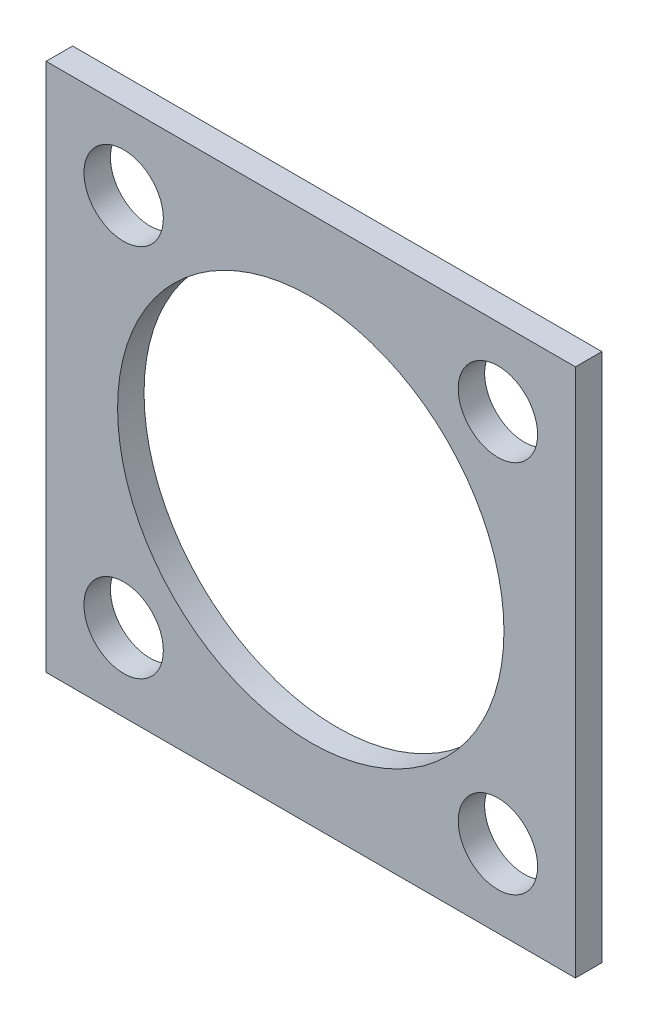
ISO-10303-21;
HEADER;
FILE_DESCRIPTION(('STEP AP214'),'2;1');
FILE_NAME('part.step','',(''),(''),'','','');
FILE_SCHEMA(('AUTOMOTIVE_DESIGN { 1 0 10303 214 1 1 1 1 }'));
ENDSEC;
DATA;
#1=APPLICATION_CONTEXT('core data for automotive mechanical design processes');
#2=APPLICATION_PROTOCOL_DEFINITION('international standard','automotive_design',2000,#1);
#3=PRODUCT_CONTEXT('',#1,'mechanical');
#4=PRODUCT('Part','Part','',(#3));
#5=PRODUCT_RELATED_PRODUCT_CATEGORY('part','',(#4));
#6=PRODUCT_DEFINITION_FORMATION('','',#4);
#7=PRODUCT_DEFINITION_CONTEXT('part definition',#1,'design');
#8=PRODUCT_DEFINITION('design','',#6,#7);
#9=PRODUCT_DEFINITION_SHAPE('','',#8);
#10=(LENGTH_UNIT() NAMED_UNIT(*) SI_UNIT(.MILLI.,.METRE.));
#11=(NAMED_UNIT(*) PLANE_ANGLE_UNIT() SI_UNIT($,.RADIAN.));
#12=(NAMED_UNIT(*) SI_UNIT($,.STERADIAN.) SOLID_ANGLE_UNIT());
#13=UNCERTAINTY_MEASURE_WITH_UNIT(LENGTH_MEASURE(1.E-05),#10,'distance_accuracy_value','');
#14=(GEOMETRIC_REPRESENTATION_CONTEXT(3) GLOBAL_UNCERTAINTY_ASSIGNED_CONTEXT((#13)) GLOBAL_UNIT_ASSIGNED_CONTEXT((#10,
#11,#12)) REPRESENTATION_CONTEXT('',''));
#15=CARTESIAN_POINT('',(0.,0.,0.));
#16=DIRECTION('',(0.,0.,1.));
#17=DIRECTION('',(1.,0.,0.));
#18=AXIS2_PLACEMENT_3D('',#15,#16,#17);
#19=CARTESIAN_POINT('',(0.,0.,1.));
#20=DIRECTION('',(0.,0.,1.));
#21=DIRECTION('',(1.,0.,0.));
#22=AXIS2_PLACEMENT_3D('',#19,#20,#21);
#23=PLANE('',#22);
#24=CARTESIAN_POINT('',(-7.07106781186547,-7.07106781186548,1.));
#25=DIRECTION('',(0.,0.,1.));
#26=DIRECTION('',(1.,0.,0.));
#27=AXIS2_PLACEMENT_3D('',#24,#25,#26);
#28=CIRCLE('',#27,1.5);
#29=CARTESIAN_POINT('',(-5.57106781186547,-7.07106781186548,1.));
#30=VERTEX_POINT('',#29);
#31=EDGE_CURVE('E134',#30,#30,#28,.T.);
#32=ORIENTED_EDGE('',*,*,#31,.F.);
#33=EDGE_LOOP('',(#32));
#34=FACE_BOUND('',#33,.T.);
#35=CARTESIAN_POINT('',(7.07106781186547,-7.07106781186547,1.));
#36=DIRECTION('',(0.,0.,1.));
#37=DIRECTION('',(1.,0.,0.));
#38=AXIS2_PLACEMENT_3D('',#35,#36,#37);
#39=CIRCLE('',#38,1.5);
#40=CARTESIAN_POINT('',(8.57106781186548,-7.07106781186547,1.));
#41=VERTEX_POINT('',#40);
#42=EDGE_CURVE('E140',#41,#41,#39,.T.);
#43=ORIENTED_EDGE('',*,*,#42,.F.);
#44=EDGE_LOOP('',(#43));
#45=FACE_BOUND('',#44,.T.);
#46=CARTESIAN_POINT('',(7.07106781186547,7.07106781186547,1.));
#47=DIRECTION('',(0.,0.,1.));
#48=DIRECTION('',(1.,0.,0.));
#49=AXIS2_PLACEMENT_3D('',#46,#47,#48);
#50=CIRCLE('',#49,1.5);
#51=CARTESIAN_POINT('',(8.57106781186548,7.07106781186547,1.));
#52=VERTEX_POINT('',#51);
#53=EDGE_CURVE('E146',#52,#52,#50,.T.);
#54=ORIENTED_EDGE('',*,*,#53,.F.);
#55=EDGE_LOOP('',(#54));
#56=FACE_BOUND('',#55,.T.);
#57=CARTESIAN_POINT('',(-7.07106781186547,7.07106781186547,1.));
#58=DIRECTION('',(0.,0.,1.));
#59=DIRECTION('',(1.,0.,0.));
#60=AXIS2_PLACEMENT_3D('',#57,#58,#59);
#61=CIRCLE('',#60,1.5);
#62=CARTESIAN_POINT('',(-5.57106781186547,7.07106781186547,1.));
#63=VERTEX_POINT('',#62);
#64=EDGE_CURVE('E128',#63,#63,#61,.T.);
#65=ORIENTED_EDGE('',*,*,#64,.F.);
#66=EDGE_LOOP('',(#65));
#67=FACE_BOUND('',#66,.T.);
#68=DIRECTION('',(0.,-1.,0.));
#69=VECTOR('',#68,1.);
#70=CARTESIAN_POINT('',(-10.,-10.,1.));
#71=LINE('',#70,#69);
#72=CARTESIAN_POINT('',(-10.,10.,1.));
#73=VERTEX_POINT('',#72);
#74=CARTESIAN_POINT('',(-10.,-10.,1.));
#75=VERTEX_POINT('',#74);
#76=EDGE_CURVE('E95',#73,#75,#71,.T.);
#77=ORIENTED_EDGE('',*,*,#76,.T.);
#78=DIRECTION('',(1.,0.,0.));
#79=VECTOR('',#78,1.);
#80=CARTESIAN_POINT('',(10.,-10.,1.));
#81=LINE('',#80,#79);
#82=CARTESIAN_POINT('',(10.,-10.,1.));
#83=VERTEX_POINT('',#82);
#84=EDGE_CURVE('E90',#75,#83,#81,.T.);
#85=ORIENTED_EDGE('',*,*,#84,.T.);
#86=DIRECTION('',(0.,1.,0.));
#87=VECTOR('',#86,1.);
#88=CARTESIAN_POINT('',(10.,-10.,1.));
#89=LINE('',#88,#87);
#90=CARTESIAN_POINT('',(10.,10.,1.));
#91=VERTEX_POINT('',#90);
#92=EDGE_CURVE('E93',#83,#91,#89,.T.);
#93=ORIENTED_EDGE('',*,*,#92,.T.);
#94=DIRECTION('',(-1.,0.,0.));
#95=VECTOR('',#94,1.);
#96=CARTESIAN_POINT('',(10.,10.,1.));
#97=LINE('',#96,#95);
#98=EDGE_CURVE('E60',#91,#73,#97,.T.);
#99=ORIENTED_EDGE('',*,*,#98,.T.);
#100=EDGE_LOOP('',(#77,#85,#93,#99));
#101=FACE_BOUND('',#100,.T.);
#102=CARTESIAN_POINT('',(0.,0.,1.));
#103=DIRECTION('',(0.,0.,1.));
#104=DIRECTION('',(1.,0.,0.));
#105=AXIS2_PLACEMENT_3D('',#102,#103,#104);
#106=CIRCLE('',#105,7.3);
#107=CARTESIAN_POINT('',(7.3,0.,1.));
#108=VERTEX_POINT('',#107);
#109=EDGE_CURVE('E110',#108,#108,#106,.T.);
#110=ORIENTED_EDGE('',*,*,#109,.F.);
#111=EDGE_LOOP('',(#110));
#112=FACE_BOUND('',#111,.T.);
#113=ADVANCED_FACE('F43',(#34,#45,#56,#67,#101,#112),#23,.T.);
#114=CARTESIAN_POINT('',(0.,0.,0.));
#115=DIRECTION('',(0.,0.,1.));
#116=DIRECTION('',(1.,0.,0.));
#117=AXIS2_PLACEMENT_3D('',#114,#115,#116);
#118=PLANE('',#117);
#119=CARTESIAN_POINT('',(-7.07106781186547,-7.07106781186548,0.));
#120=DIRECTION('',(0.,0.,1.));
#121=DIRECTION('',(1.,0.,0.));
#122=AXIS2_PLACEMENT_3D('',#119,#120,#121);
#123=CIRCLE('',#122,1.5);
#124=CARTESIAN_POINT('',(-5.57106781186547,-7.07106781186548,0.));
#125=VERTEX_POINT('',#124);
#126=EDGE_CURVE('E137',#125,#125,#123,.T.);
#127=ORIENTED_EDGE('',*,*,#126,.T.);
#128=EDGE_LOOP('',(#127));
#129=FACE_BOUND('',#128,.T.);
#130=CARTESIAN_POINT('',(7.07106781186547,-7.07106781186547,0.));
#131=DIRECTION('',(0.,0.,1.));
#132=DIRECTION('',(1.,0.,0.));
#133=AXIS2_PLACEMENT_3D('',#130,#131,#132);
#134=CIRCLE('',#133,1.5);
#135=CARTESIAN_POINT('',(8.57106781186548,-7.07106781186547,0.));
#136=VERTEX_POINT('',#135);
#137=EDGE_CURVE('E143',#136,#136,#134,.T.);
#138=ORIENTED_EDGE('',*,*,#137,.T.);
#139=EDGE_LOOP('',(#138));
#140=FACE_BOUND('',#139,.T.);
#141=CARTESIAN_POINT('',(7.07106781186547,7.07106781186547,0.));
#142=DIRECTION('',(0.,0.,1.));
#143=DIRECTION('',(1.,0.,0.));
#144=AXIS2_PLACEMENT_3D('',#141,#142,#143);
#145=CIRCLE('',#144,1.5);
#146=CARTESIAN_POINT('',(8.57106781186548,7.07106781186547,0.));
#147=VERTEX_POINT('',#146);
#148=EDGE_CURVE('E131',#147,#147,#145,.T.);
#149=ORIENTED_EDGE('',*,*,#148,.T.);
#150=EDGE_LOOP('',(#149));
#151=FACE_BOUND('',#150,.T.);
#152=CARTESIAN_POINT('',(-7.07106781186547,7.07106781186547,0.));
#153=DIRECTION('',(0.,0.,1.));
#154=DIRECTION('',(1.,0.,0.));
#155=AXIS2_PLACEMENT_3D('',#152,#153,#154);
#156=CIRCLE('',#155,1.5);
#157=CARTESIAN_POINT('',(-5.57106781186547,7.07106781186547,0.));
#158=VERTEX_POINT('',#157);
#159=EDGE_CURVE('E125',#158,#158,#156,.T.);
#160=ORIENTED_EDGE('',*,*,#159,.T.);
#161=EDGE_LOOP('',(#160));
#162=FACE_BOUND('',#161,.T.);
#163=DIRECTION('',(0.,-1.,0.));
#164=VECTOR('',#163,1.);
#165=CARTESIAN_POINT('',(-10.,-10.,0.));
#166=LINE('',#165,#164);
#167=CARTESIAN_POINT('',(-10.,10.,0.));
#168=VERTEX_POINT('',#167);
#169=CARTESIAN_POINT('',(-10.,-10.,0.));
#170=VERTEX_POINT('',#169);
#171=EDGE_CURVE('E107',#168,#170,#166,.T.);
#172=ORIENTED_EDGE('',*,*,#171,.F.);
#173=DIRECTION('',(-1.,0.,0.));
#174=VECTOR('',#173,1.);
#175=CARTESIAN_POINT('',(10.,10.,0.));
#176=LINE('',#175,#174);
#177=CARTESIAN_POINT('',(10.,10.,0.));
#178=VERTEX_POINT('',#177);
#179=EDGE_CURVE('E83',#178,#168,#176,.T.);
#180=ORIENTED_EDGE('',*,*,#179,.F.);
#181=DIRECTION('',(0.,1.,0.));
#182=VECTOR('',#181,1.);
#183=CARTESIAN_POINT('',(10.,-10.,0.));
#184=LINE('',#183,#182);
#185=CARTESIAN_POINT('',(10.,-10.,0.));
#186=VERTEX_POINT('',#185);
#187=EDGE_CURVE('E77',#186,#178,#184,.T.);
#188=ORIENTED_EDGE('',*,*,#187,.F.);
#189=DIRECTION('',(1.,0.,0.));
#190=VECTOR('',#189,1.);
#191=CARTESIAN_POINT('',(10.,-10.,0.));
#192=LINE('',#191,#190);
#193=EDGE_CURVE('E99',#170,#186,#192,.T.);
#194=ORIENTED_EDGE('',*,*,#193,.F.);
#195=EDGE_LOOP('',(#172,#180,#188,#194));
#196=FACE_BOUND('',#195,.T.);
#197=CARTESIAN_POINT('',(0.,0.,0.));
#198=DIRECTION('',(0.,0.,1.));
#199=DIRECTION('',(1.,0.,0.));
#200=AXIS2_PLACEMENT_3D('',#197,#198,#199);
#201=CIRCLE('',#200,7.3);
#202=CARTESIAN_POINT('',(7.3,0.,0.));
#203=VERTEX_POINT('',#202);
#204=EDGE_CURVE('E122',#203,#203,#201,.T.);
#205=ORIENTED_EDGE('',*,*,#204,.T.);
#206=EDGE_LOOP('',(#205));
#207=FACE_BOUND('',#206,.T.);
#208=ADVANCED_FACE('F118',(#129,#140,#151,#162,#196,#207),#118,.F.);
#209=CARTESIAN_POINT('',(-10.,-10.,1.));
#210=DIRECTION('',(1.,0.,0.));
#211=DIRECTION('',(0.,0.,-1.));
#212=AXIS2_PLACEMENT_3D('',#209,#210,#211);
#213=PLANE('',#212);
#214=ORIENTED_EDGE('',*,*,#171,.T.);
#215=DIRECTION('',(0.,0.,-1.));
#216=VECTOR('',#215,1.);
#217=CARTESIAN_POINT('',(-10.,-10.,1.));
#218=LINE('',#217,#216);
#219=EDGE_CURVE('E11',#75,#170,#218,.T.);
#220=ORIENTED_EDGE('',*,*,#219,.F.);
#221=ORIENTED_EDGE('',*,*,#76,.F.);
#222=DIRECTION('',(0.,0.,-1.));
#223=VECTOR('',#222,1.);
#224=CARTESIAN_POINT('',(-10.,10.,1.));
#225=LINE('',#224,#223);
#226=EDGE_CURVE('E103',#73,#168,#225,.T.);
#227=ORIENTED_EDGE('',*,*,#226,.T.);
#228=EDGE_LOOP('',(#214,#220,#221,#227));
#229=FACE_BOUND('',#228,.T.);
#230=ADVANCED_FACE('F45',(#229),#213,.F.);
#231=CARTESIAN_POINT('',(10.,-10.,1.));
#232=DIRECTION('',(0.,1.,0.));
#233=DIRECTION('',(0.,0.,1.));
#234=AXIS2_PLACEMENT_3D('',#231,#232,#233);
#235=PLANE('',#234);
#236=ORIENTED_EDGE('',*,*,#193,.T.);
#237=DIRECTION('',(0.,0.,-1.));
#238=VECTOR('',#237,1.);
#239=CARTESIAN_POINT('',(10.,-10.,1.));
#240=LINE('',#239,#238);
#241=EDGE_CURVE('E52',#83,#186,#240,.T.);
#242=ORIENTED_EDGE('',*,*,#241,.F.);
#243=ORIENTED_EDGE('',*,*,#84,.F.);
#244=ORIENTED_EDGE('',*,*,#219,.T.);
#245=EDGE_LOOP('',(#236,#242,#243,#244));
#246=FACE_BOUND('',#245,.T.);
#247=ADVANCED_FACE('F98',(#246),#235,.F.);
#248=CARTESIAN_POINT('',(10.,-10.,1.));
#249=DIRECTION('',(-1.,0.,0.));
#250=DIRECTION('',(0.,0.,1.));
#251=AXIS2_PLACEMENT_3D('',#248,#249,#250);
#252=PLANE('',#251);
#253=ORIENTED_EDGE('',*,*,#187,.T.);
#254=DIRECTION('',(0.,0.,-1.));
#255=VECTOR('',#254,1.);
#256=CARTESIAN_POINT('',(10.,10.,1.));
#257=LINE('',#256,#255);
#258=EDGE_CURVE('E100',#91,#178,#257,.T.);
#259=ORIENTED_EDGE('',*,*,#258,.F.);
#260=ORIENTED_EDGE('',*,*,#92,.F.);
#261=ORIENTED_EDGE('',*,*,#241,.T.);
#262=EDGE_LOOP('',(#253,#259,#260,#261));
#263=FACE_BOUND('',#262,.T.);
#264=ADVANCED_FACE('F101',(#263),#252,.F.);
#265=CARTESIAN_POINT('',(10.,10.,1.));
#266=DIRECTION('',(0.,-1.,0.));
#267=DIRECTION('',(1.,0.,0.));
#268=AXIS2_PLACEMENT_3D('',#265,#266,#267);
#269=PLANE('',#268);
#270=ORIENTED_EDGE('',*,*,#179,.T.);
#271=ORIENTED_EDGE('',*,*,#226,.F.);
#272=ORIENTED_EDGE('',*,*,#98,.F.);
#273=ORIENTED_EDGE('',*,*,#258,.T.);
#274=EDGE_LOOP('',(#270,#271,#272,#273));
#275=FACE_BOUND('',#274,.T.);
#276=ADVANCED_FACE('F115',(#275),#269,.F.);
#277=CARTESIAN_POINT('',(0.,0.,1.));
#278=DIRECTION('',(0.,0.,-1.));
#279=DIRECTION('',(-1.,0.,0.));
#280=AXIS2_PLACEMENT_3D('',#277,#278,#279);
#281=CYLINDRICAL_SURFACE('',#280,7.3);
#282=ORIENTED_EDGE('',*,*,#109,.T.);
#283=EDGE_LOOP('',(#282));
#284=FACE_BOUND('',#283,.T.);
#285=ORIENTED_EDGE('',*,*,#204,.F.);
#286=EDGE_LOOP('',(#285));
#287=FACE_BOUND('',#286,.T.);
#288=ADVANCED_FACE('F169',(#284,#287),#281,.F.);
#289=CARTESIAN_POINT('',(-7.07106781186547,7.07106781186547,0.));
#290=DIRECTION('',(0.,0.,1.));
#291=DIRECTION('',(1.,0.,0.));
#292=AXIS2_PLACEMENT_3D('',#289,#290,#291);
#293=CYLINDRICAL_SURFACE('',#292,1.5);
#294=ORIENTED_EDGE('',*,*,#159,.F.);
#295=EDGE_LOOP('',(#294));
#296=FACE_BOUND('',#295,.T.);
#297=ORIENTED_EDGE('',*,*,#64,.T.);
#298=EDGE_LOOP('',(#297));
#299=FACE_BOUND('',#298,.T.);
#300=ADVANCED_FACE('F158',(#296,#299),#293,.F.);
#301=CARTESIAN_POINT('',(7.07106781186547,7.07106781186547,0.));
#302=DIRECTION('',(0.,0.,1.));
#303=DIRECTION('',(1.,0.,0.));
#304=AXIS2_PLACEMENT_3D('',#301,#302,#303);
#305=CYLINDRICAL_SURFACE('',#304,1.5);
#306=ORIENTED_EDGE('',*,*,#148,.F.);
#307=EDGE_LOOP('',(#306));
#308=FACE_BOUND('',#307,.T.);
#309=ORIENTED_EDGE('',*,*,#53,.T.);
#310=EDGE_LOOP('',(#309));
#311=FACE_BOUND('',#310,.T.);
#312=ADVANCED_FACE('F154',(#308,#311),#305,.F.);
#313=CARTESIAN_POINT('',(7.07106781186547,-7.07106781186547,0.));
#314=DIRECTION('',(0.,0.,1.));
#315=DIRECTION('',(1.,0.,0.));
#316=AXIS2_PLACEMENT_3D('',#313,#314,#315);
#317=CYLINDRICAL_SURFACE('',#316,1.5);
#318=ORIENTED_EDGE('',*,*,#137,.F.);
#319=EDGE_LOOP('',(#318));
#320=FACE_BOUND('',#319,.T.);
#321=ORIENTED_EDGE('',*,*,#42,.T.);
#322=EDGE_LOOP('',(#321));
#323=FACE_BOUND('',#322,.T.);
#324=ADVANCED_FACE('F157',(#320,#323),#317,.F.);
#325=CARTESIAN_POINT('',(-7.07106781186547,-7.07106781186548,0.));
#326=DIRECTION('',(0.,0.,1.));
#327=DIRECTION('',(1.,0.,0.));
#328=AXIS2_PLACEMENT_3D('',#325,#326,#327);
#329=CYLINDRICAL_SURFACE('',#328,1.5);
#330=ORIENTED_EDGE('',*,*,#126,.F.);
#331=EDGE_LOOP('',(#330));
#332=FACE_BOUND('',#331,.T.);
#333=ORIENTED_EDGE('',*,*,#31,.T.);
#334=EDGE_LOOP('',(#333));
#335=FACE_BOUND('',#334,.T.);
#336=ADVANCED_FACE('F180',(#332,#335),#329,.F.);
#337=CLOSED_SHELL('',(#113,#208,#230,#247,#264,#276,#288,#300,#312,#324,#336));
#338=MANIFOLD_SOLID_BREP('B2',#337);
#339=ADVANCED_BREP_SHAPE_REPRESENTATION('',(#18,#338),#14);
#340=SHAPE_DEFINITION_REPRESENTATION(#9,#339);
ENDSEC;
END-ISO-10303-21;
